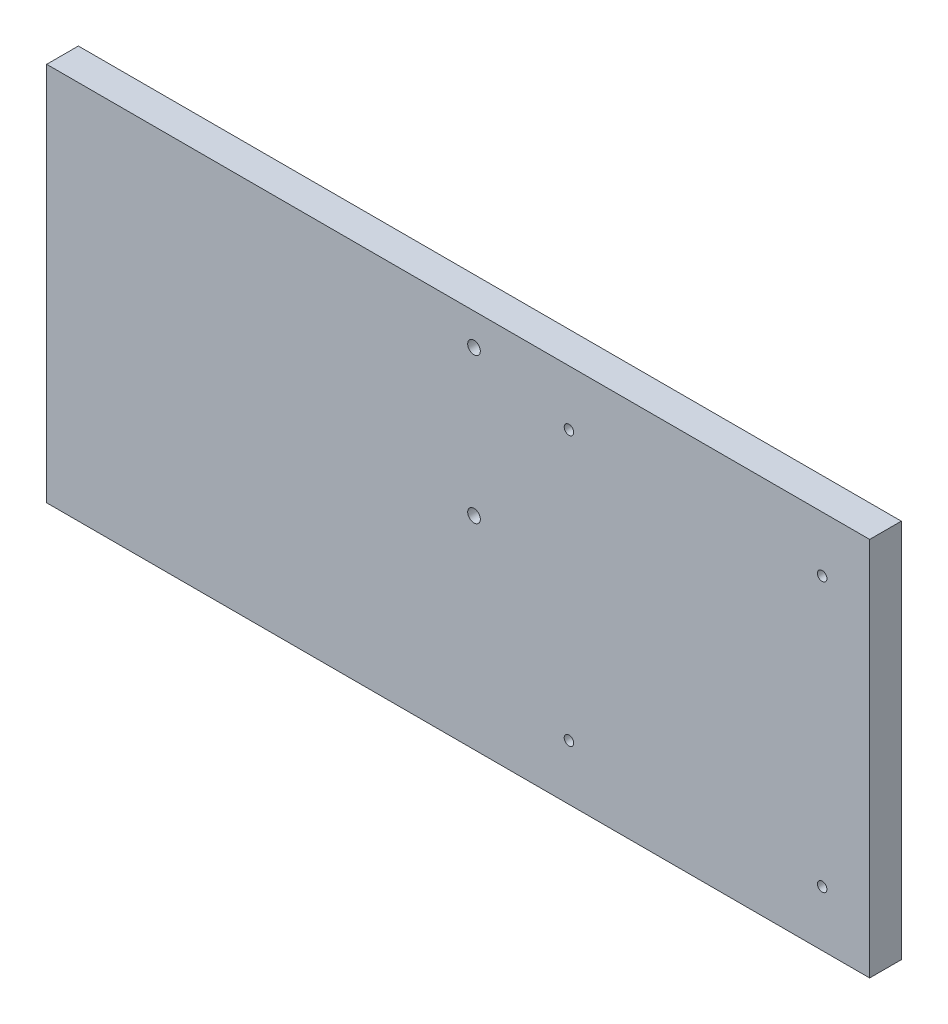
ISO-10303-21;
HEADER;
FILE_DESCRIPTION(('STEP AP214'),'2;1');
FILE_NAME('part.step','',(''),(''),'','','');
FILE_SCHEMA(('AUTOMOTIVE_DESIGN { 1 0 10303 214 1 1 1 1 }'));
ENDSEC;
DATA;
#1=APPLICATION_CONTEXT('core data for automotive mechanical design processes');
#2=APPLICATION_PROTOCOL_DEFINITION('international standard','automotive_design',2000,#1);
#3=PRODUCT_CONTEXT('',#1,'mechanical');
#4=PRODUCT('Part','Part','',(#3));
#5=PRODUCT_RELATED_PRODUCT_CATEGORY('part','',(#4));
#6=PRODUCT_DEFINITION_FORMATION('','',#4);
#7=PRODUCT_DEFINITION_CONTEXT('part definition',#1,'design');
#8=PRODUCT_DEFINITION('design','',#6,#7);
#9=PRODUCT_DEFINITION_SHAPE('','',#8);
#10=(LENGTH_UNIT() NAMED_UNIT(*) SI_UNIT(.MILLI.,.METRE.));
#11=(NAMED_UNIT(*) PLANE_ANGLE_UNIT() SI_UNIT($,.RADIAN.));
#12=(NAMED_UNIT(*) SI_UNIT($,.STERADIAN.) SOLID_ANGLE_UNIT());
#13=UNCERTAINTY_MEASURE_WITH_UNIT(LENGTH_MEASURE(1.E-05),#10,'distance_accuracy_value','');
#14=(GEOMETRIC_REPRESENTATION_CONTEXT(3) GLOBAL_UNCERTAINTY_ASSIGNED_CONTEXT((#13)) GLOBAL_UNIT_ASSIGNED_CONTEXT((#10,
#11,#12)) REPRESENTATION_CONTEXT('',''));
#15=CARTESIAN_POINT('',(0.,0.,0.));
#16=DIRECTION('',(0.,0.,1.));
#17=DIRECTION('',(1.,0.,0.));
#18=AXIS2_PLACEMENT_3D('',#15,#16,#17);
#19=CARTESIAN_POINT('',(130.,0.,10.));
#20=DIRECTION('',(1.,0.,0.));
#21=DIRECTION('',(0.,1.,0.));
#22=AXIS2_PLACEMENT_3D('',#19,#20,#21);
#23=PLANE('',#22);
#24=DIRECTION('',(0.,-1.,0.));
#25=VECTOR('',#24,1.);
#26=CARTESIAN_POINT('',(130.,0.,0.));
#27=LINE('',#26,#25);
#28=CARTESIAN_POINT('',(130.,60.,0.));
#29=VERTEX_POINT('',#28);
#30=CARTESIAN_POINT('',(130.,-60.,0.));
#31=VERTEX_POINT('',#30);
#32=EDGE_CURVE('E124',#29,#31,#27,.T.);
#33=ORIENTED_EDGE('',*,*,#32,.F.);
#34=DIRECTION('',(0.,0.,-1.));
#35=VECTOR('',#34,1.);
#36=CARTESIAN_POINT('',(130.,60.,10.));
#37=LINE('',#36,#35);
#38=CARTESIAN_POINT('',(130.,60.,10.));
#39=VERTEX_POINT('',#38);
#40=EDGE_CURVE('E11',#39,#29,#37,.T.);
#41=ORIENTED_EDGE('',*,*,#40,.F.);
#42=DIRECTION('',(0.,-1.,0.));
#43=VECTOR('',#42,1.);
#44=CARTESIAN_POINT('',(130.,0.,10.));
#45=LINE('',#44,#43);
#46=CARTESIAN_POINT('',(130.,-60.,10.));
#47=VERTEX_POINT('',#46);
#48=EDGE_CURVE('E99',#39,#47,#45,.T.);
#49=ORIENTED_EDGE('',*,*,#48,.T.);
#50=DIRECTION('',(0.,0.,-1.));
#51=VECTOR('',#50,1.);
#52=CARTESIAN_POINT('',(130.,-60.,10.));
#53=LINE('',#52,#51);
#54=EDGE_CURVE('E77',#47,#31,#53,.T.);
#55=ORIENTED_EDGE('',*,*,#54,.T.);
#56=EDGE_LOOP('',(#33,#41,#49,#55));
#57=FACE_BOUND('',#56,.T.);
#58=ADVANCED_FACE('F37',(#57),#23,.T.);
#59=CARTESIAN_POINT('',(0.,60.,10.));
#60=DIRECTION('',(0.,1.,0.));
#61=DIRECTION('',(-1.,0.,0.));
#62=AXIS2_PLACEMENT_3D('',#59,#60,#61);
#63=PLANE('',#62);
#64=DIRECTION('',(1.,0.,0.));
#65=VECTOR('',#64,1.);
#66=CARTESIAN_POINT('',(0.,60.,0.));
#67=LINE('',#66,#65);
#68=CARTESIAN_POINT('',(-130.,60.,0.));
#69=VERTEX_POINT('',#68);
#70=EDGE_CURVE('E89',#69,#29,#67,.T.);
#71=ORIENTED_EDGE('',*,*,#70,.F.);
#72=DIRECTION('',(0.,0.,-1.));
#73=VECTOR('',#72,1.);
#74=CARTESIAN_POINT('',(-130.,60.,10.));
#75=LINE('',#74,#73);
#76=CARTESIAN_POINT('',(-130.,60.,10.));
#77=VERTEX_POINT('',#76);
#78=EDGE_CURVE('E46',#77,#69,#75,.T.);
#79=ORIENTED_EDGE('',*,*,#78,.F.);
#80=DIRECTION('',(1.,0.,0.));
#81=VECTOR('',#80,1.);
#82=CARTESIAN_POINT('',(0.,60.,10.));
#83=LINE('',#82,#81);
#84=EDGE_CURVE('E87',#77,#39,#83,.T.);
#85=ORIENTED_EDGE('',*,*,#84,.T.);
#86=ORIENTED_EDGE('',*,*,#40,.T.);
#87=EDGE_LOOP('',(#71,#79,#85,#86));
#88=FACE_BOUND('',#87,.T.);
#89=ADVANCED_FACE('F85',(#88),#63,.T.);
#90=CARTESIAN_POINT('',(-130.,0.,10.));
#91=DIRECTION('',(1.,0.,0.));
#92=DIRECTION('',(0.,1.,0.));
#93=AXIS2_PLACEMENT_3D('',#90,#91,#92);
#94=PLANE('',#93);
#95=DIRECTION('',(0.,-1.,0.));
#96=VECTOR('',#95,1.);
#97=CARTESIAN_POINT('',(-130.,0.,0.));
#98=LINE('',#97,#96);
#99=CARTESIAN_POINT('',(-130.,-60.,0.));
#100=VERTEX_POINT('',#99);
#101=EDGE_CURVE('E127',#69,#100,#98,.T.);
#102=ORIENTED_EDGE('',*,*,#101,.T.);
#103=DIRECTION('',(0.,0.,-1.));
#104=VECTOR('',#103,1.);
#105=CARTESIAN_POINT('',(-130.,-60.,10.));
#106=LINE('',#105,#104);
#107=CARTESIAN_POINT('',(-130.,-60.,10.));
#108=VERTEX_POINT('',#107);
#109=EDGE_CURVE('E92',#108,#100,#106,.T.);
#110=ORIENTED_EDGE('',*,*,#109,.F.);
#111=DIRECTION('',(0.,-1.,0.));
#112=VECTOR('',#111,1.);
#113=CARTESIAN_POINT('',(-130.,0.,10.));
#114=LINE('',#113,#112);
#115=EDGE_CURVE('E94',#77,#108,#114,.T.);
#116=ORIENTED_EDGE('',*,*,#115,.F.);
#117=ORIENTED_EDGE('',*,*,#78,.T.);
#118=EDGE_LOOP('',(#102,#110,#116,#117));
#119=FACE_BOUND('',#118,.T.);
#120=ADVANCED_FACE('F95',(#119),#94,.F.);
#121=CARTESIAN_POINT('',(0.,-60.,10.));
#122=DIRECTION('',(0.,1.,0.));
#123=DIRECTION('',(-1.,0.,0.));
#124=AXIS2_PLACEMENT_3D('',#121,#122,#123);
#125=PLANE('',#124);
#126=DIRECTION('',(1.,0.,0.));
#127=VECTOR('',#126,1.);
#128=CARTESIAN_POINT('',(0.,-60.,0.));
#129=LINE('',#128,#127);
#130=EDGE_CURVE('E70',#100,#31,#129,.T.);
#131=ORIENTED_EDGE('',*,*,#130,.T.);
#132=ORIENTED_EDGE('',*,*,#54,.F.);
#133=DIRECTION('',(1.,0.,0.));
#134=VECTOR('',#133,1.);
#135=CARTESIAN_POINT('',(0.,-60.,10.));
#136=LINE('',#135,#134);
#137=EDGE_CURVE('E54',#108,#47,#136,.T.);
#138=ORIENTED_EDGE('',*,*,#137,.F.);
#139=ORIENTED_EDGE('',*,*,#109,.T.);
#140=EDGE_LOOP('',(#131,#132,#138,#139));
#141=FACE_BOUND('',#140,.T.);
#142=ADVANCED_FACE('F136',(#141),#125,.F.);
#143=CARTESIAN_POINT('',(115.,42.5,10.));
#144=DIRECTION('',(0.,0.,-1.));
#145=DIRECTION('',(-1.,0.,0.));
#146=AXIS2_PLACEMENT_3D('',#143,#144,#145);
#147=CYLINDRICAL_SURFACE('',#146,1.5);
#148=CARTESIAN_POINT('',(115.,42.5,10.));
#149=DIRECTION('',(0.,0.,1.));
#150=DIRECTION('',(1.,0.,0.));
#151=AXIS2_PLACEMENT_3D('',#148,#149,#150);
#152=CIRCLE('',#151,1.5);
#153=CARTESIAN_POINT('',(116.5,42.5,10.));
#154=VERTEX_POINT('',#153);
#155=EDGE_CURVE('E101',#154,#154,#152,.T.);
#156=ORIENTED_EDGE('',*,*,#155,.T.);
#157=EDGE_LOOP('',(#156));
#158=FACE_BOUND('',#157,.T.);
#159=CARTESIAN_POINT('',(115.,42.5,0.));
#160=DIRECTION('',(0.,0.,1.));
#161=DIRECTION('',(1.,0.,0.));
#162=AXIS2_PLACEMENT_3D('',#159,#160,#161);
#163=CIRCLE('',#162,1.5);
#164=CARTESIAN_POINT('',(116.5,42.5,0.));
#165=VERTEX_POINT('',#164);
#166=EDGE_CURVE('E121',#165,#165,#163,.T.);
#167=ORIENTED_EDGE('',*,*,#166,.F.);
#168=EDGE_LOOP('',(#167));
#169=FACE_BOUND('',#168,.T.);
#170=ADVANCED_FACE('F147',(#158,#169),#147,.F.);
#171=CARTESIAN_POINT('',(115.,-42.5,10.));
#172=DIRECTION('',(0.,0.,-1.));
#173=DIRECTION('',(-1.,0.,0.));
#174=AXIS2_PLACEMENT_3D('',#171,#172,#173);
#175=CYLINDRICAL_SURFACE('',#174,1.5);
#176=CARTESIAN_POINT('',(115.,-42.5,10.));
#177=DIRECTION('',(0.,0.,1.));
#178=DIRECTION('',(1.,0.,0.));
#179=AXIS2_PLACEMENT_3D('',#176,#177,#178);
#180=CIRCLE('',#179,1.5);
#181=CARTESIAN_POINT('',(116.5,-42.5,10.));
#182=VERTEX_POINT('',#181);
#183=EDGE_CURVE('E279',#182,#182,#180,.F.);
#184=ORIENTED_EDGE('',*,*,#183,.F.);
#185=EDGE_LOOP('',(#184));
#186=FACE_BOUND('',#185,.T.);
#187=CARTESIAN_POINT('',(115.,-42.5,0.));
#188=DIRECTION('',(0.,0.,1.));
#189=DIRECTION('',(1.,0.,0.));
#190=AXIS2_PLACEMENT_3D('',#187,#188,#189);
#191=CIRCLE('',#190,1.5);
#192=CARTESIAN_POINT('',(116.5,-42.5,0.));
#193=VERTEX_POINT('',#192);
#194=EDGE_CURVE('E118',#193,#193,#191,.F.);
#195=ORIENTED_EDGE('',*,*,#194,.T.);
#196=EDGE_LOOP('',(#195));
#197=FACE_BOUND('',#196,.T.);
#198=ADVANCED_FACE('F150',(#186,#197),#175,.F.);
#199=CARTESIAN_POINT('',(35.,42.4999999999994,10.));
#200=DIRECTION('',(0.,0.,-1.));
#201=DIRECTION('',(-1.,0.,0.));
#202=AXIS2_PLACEMENT_3D('',#199,#200,#201);
#203=CYLINDRICAL_SURFACE('',#202,1.5);
#204=CARTESIAN_POINT('',(35.,42.4999999999994,10.));
#205=DIRECTION('',(0.,0.,1.));
#206=DIRECTION('',(1.,0.,0.));
#207=AXIS2_PLACEMENT_3D('',#204,#205,#206);
#208=CIRCLE('',#207,1.5);
#209=CARTESIAN_POINT('',(36.5,42.4999999999994,10.));
#210=VERTEX_POINT('',#209);
#211=EDGE_CURVE('E275',#210,#210,#208,.T.);
#212=ORIENTED_EDGE('',*,*,#211,.T.);
#213=EDGE_LOOP('',(#212));
#214=FACE_BOUND('',#213,.T.);
#215=CARTESIAN_POINT('',(35.,42.4999999999994,0.));
#216=DIRECTION('',(0.,0.,1.));
#217=DIRECTION('',(1.,0.,0.));
#218=AXIS2_PLACEMENT_3D('',#215,#216,#217);
#219=CIRCLE('',#218,1.5);
#220=CARTESIAN_POINT('',(36.5,42.4999999999994,0.));
#221=VERTEX_POINT('',#220);
#222=EDGE_CURVE('E115',#221,#221,#219,.T.);
#223=ORIENTED_EDGE('',*,*,#222,.F.);
#224=EDGE_LOOP('',(#223));
#225=FACE_BOUND('',#224,.T.);
#226=ADVANCED_FACE('F154',(#214,#225),#203,.F.);
#227=CARTESIAN_POINT('',(4.99999999999998,50.,10.));
#228=DIRECTION('',(0.,0.,-1.));
#229=DIRECTION('',(-1.,0.,0.));
#230=AXIS2_PLACEMENT_3D('',#227,#228,#229);
#231=CYLINDRICAL_SURFACE('',#230,2.);
#232=CARTESIAN_POINT('',(4.99999999999998,50.,10.));
#233=DIRECTION('',(0.,0.,1.));
#234=DIRECTION('',(1.,0.,0.));
#235=AXIS2_PLACEMENT_3D('',#232,#233,#234);
#236=CIRCLE('',#235,2.);
#237=CARTESIAN_POINT('',(6.99999999999998,50.,10.));
#238=VERTEX_POINT('',#237);
#239=EDGE_CURVE('E169',#238,#238,#236,.T.);
#240=ORIENTED_EDGE('',*,*,#239,.T.);
#241=EDGE_LOOP('',(#240));
#242=FACE_BOUND('',#241,.T.);
#243=CARTESIAN_POINT('',(4.99999999999998,50.,0.));
#244=DIRECTION('',(0.,0.,1.));
#245=DIRECTION('',(1.,0.,0.));
#246=AXIS2_PLACEMENT_3D('',#243,#244,#245);
#247=CIRCLE('',#246,2.);
#248=CARTESIAN_POINT('',(6.99999999999998,50.,0.));
#249=VERTEX_POINT('',#248);
#250=EDGE_CURVE('E112',#249,#249,#247,.T.);
#251=ORIENTED_EDGE('',*,*,#250,.F.);
#252=EDGE_LOOP('',(#251));
#253=FACE_BOUND('',#252,.T.);
#254=ADVANCED_FACE('F157',(#242,#253),#231,.F.);
#255=CARTESIAN_POINT('',(4.99999999999998,3.99999999999997,10.));
#256=DIRECTION('',(0.,0.,-1.));
#257=DIRECTION('',(-1.,0.,0.));
#258=AXIS2_PLACEMENT_3D('',#255,#256,#257);
#259=CYLINDRICAL_SURFACE('',#258,2.);
#260=CARTESIAN_POINT('',(4.99999999999998,3.99999999999997,10.));
#261=DIRECTION('',(0.,0.,1.));
#262=DIRECTION('',(1.,0.,0.));
#263=AXIS2_PLACEMENT_3D('',#260,#261,#262);
#264=CIRCLE('',#263,2.);
#265=CARTESIAN_POINT('',(6.99999999999999,3.99999999999997,10.));
#266=VERTEX_POINT('',#265);
#267=EDGE_CURVE('E133',#266,#266,#264,.T.);
#268=ORIENTED_EDGE('',*,*,#267,.T.);
#269=EDGE_LOOP('',(#268));
#270=FACE_BOUND('',#269,.T.);
#271=CARTESIAN_POINT('',(4.99999999999998,3.99999999999997,0.));
#272=DIRECTION('',(0.,0.,1.));
#273=DIRECTION('',(1.,0.,0.));
#274=AXIS2_PLACEMENT_3D('',#271,#272,#273);
#275=CIRCLE('',#274,2.);
#276=CARTESIAN_POINT('',(6.99999999999999,3.99999999999997,0.));
#277=VERTEX_POINT('',#276);
#278=EDGE_CURVE('E109',#277,#277,#275,.T.);
#279=ORIENTED_EDGE('',*,*,#278,.F.);
#280=EDGE_LOOP('',(#279));
#281=FACE_BOUND('',#280,.T.);
#282=ADVANCED_FACE('F39',(#270,#281),#259,.F.);
#283=CARTESIAN_POINT('',(35.,-42.5000000000006,10.));
#284=DIRECTION('',(0.,0.,-1.));
#285=DIRECTION('',(-1.,0.,0.));
#286=AXIS2_PLACEMENT_3D('',#283,#284,#285);
#287=CYLINDRICAL_SURFACE('',#286,1.5);
#288=CARTESIAN_POINT('',(35.,-42.5000000000006,10.));
#289=DIRECTION('',(0.,0.,1.));
#290=DIRECTION('',(1.,0.,0.));
#291=AXIS2_PLACEMENT_3D('',#288,#289,#290);
#292=CIRCLE('',#291,1.5);
#293=CARTESIAN_POINT('',(36.5,-42.5000000000006,10.));
#294=VERTEX_POINT('',#293);
#295=EDGE_CURVE('E106',#294,#294,#292,.F.);
#296=ORIENTED_EDGE('',*,*,#295,.F.);
#297=EDGE_LOOP('',(#296));
#298=FACE_BOUND('',#297,.T.);
#299=CARTESIAN_POINT('',(35.,-42.5000000000006,0.));
#300=DIRECTION('',(0.,0.,1.));
#301=DIRECTION('',(1.,0.,0.));
#302=AXIS2_PLACEMENT_3D('',#299,#300,#301);
#303=CIRCLE('',#302,1.5);
#304=CARTESIAN_POINT('',(36.5,-42.5000000000006,0.));
#305=VERTEX_POINT('',#304);
#306=EDGE_CURVE('E130',#305,#305,#303,.F.);
#307=ORIENTED_EDGE('',*,*,#306,.T.);
#308=EDGE_LOOP('',(#307));
#309=FACE_BOUND('',#308,.T.);
#310=ADVANCED_FACE('F164',(#298,#309),#287,.F.);
#311=CARTESIAN_POINT('',(0.,0.,10.));
#312=DIRECTION('',(0.,0.,1.));
#313=DIRECTION('',(1.,0.,0.));
#314=AXIS2_PLACEMENT_3D('',#311,#312,#313);
#315=PLANE('',#314);
#316=ORIENTED_EDGE('',*,*,#267,.F.);
#317=EDGE_LOOP('',(#316));
#318=FACE_BOUND('',#317,.T.);
#319=ORIENTED_EDGE('',*,*,#239,.F.);
#320=EDGE_LOOP('',(#319));
#321=FACE_BOUND('',#320,.T.);
#322=ORIENTED_EDGE('',*,*,#211,.F.);
#323=EDGE_LOOP('',(#322));
#324=FACE_BOUND('',#323,.T.);
#325=ORIENTED_EDGE('',*,*,#183,.T.);
#326=EDGE_LOOP('',(#325));
#327=FACE_BOUND('',#326,.T.);
#328=ORIENTED_EDGE('',*,*,#155,.F.);
#329=EDGE_LOOP('',(#328));
#330=FACE_BOUND('',#329,.T.);
#331=ORIENTED_EDGE('',*,*,#48,.F.);
#332=ORIENTED_EDGE('',*,*,#84,.F.);
#333=ORIENTED_EDGE('',*,*,#115,.T.);
#334=ORIENTED_EDGE('',*,*,#137,.T.);
#335=EDGE_LOOP('',(#331,#332,#333,#334));
#336=FACE_BOUND('',#335,.T.);
#337=ORIENTED_EDGE('',*,*,#295,.T.);
#338=EDGE_LOOP('',(#337));
#339=FACE_BOUND('',#338,.T.);
#340=ADVANCED_FACE('F97',(#318,#321,#324,#327,#330,#336,#339),#315,.T.);
#341=CARTESIAN_POINT('',(0.,0.,0.));
#342=DIRECTION('',(0.,0.,1.));
#343=DIRECTION('',(1.,0.,0.));
#344=AXIS2_PLACEMENT_3D('',#341,#342,#343);
#345=PLANE('',#344);
#346=ORIENTED_EDGE('',*,*,#278,.T.);
#347=EDGE_LOOP('',(#346));
#348=FACE_BOUND('',#347,.T.);
#349=ORIENTED_EDGE('',*,*,#250,.T.);
#350=EDGE_LOOP('',(#349));
#351=FACE_BOUND('',#350,.T.);
#352=ORIENTED_EDGE('',*,*,#222,.T.);
#353=EDGE_LOOP('',(#352));
#354=FACE_BOUND('',#353,.T.);
#355=ORIENTED_EDGE('',*,*,#194,.F.);
#356=EDGE_LOOP('',(#355));
#357=FACE_BOUND('',#356,.T.);
#358=ORIENTED_EDGE('',*,*,#166,.T.);
#359=EDGE_LOOP('',(#358));
#360=FACE_BOUND('',#359,.T.);
#361=ORIENTED_EDGE('',*,*,#32,.T.);
#362=ORIENTED_EDGE('',*,*,#130,.F.);
#363=ORIENTED_EDGE('',*,*,#101,.F.);
#364=ORIENTED_EDGE('',*,*,#70,.T.);
#365=EDGE_LOOP('',(#361,#362,#363,#364));
#366=FACE_BOUND('',#365,.T.);
#367=ORIENTED_EDGE('',*,*,#306,.F.);
#368=EDGE_LOOP('',(#367));
#369=FACE_BOUND('',#368,.T.);
#370=ADVANCED_FACE('F137',(#348,#351,#354,#357,#360,#366,#369),#345,.F.);
#371=CLOSED_SHELL('',(#58,#89,#120,#142,#170,#198,#226,#254,#282,#310,#340,#370));
#372=MANIFOLD_SOLID_BREP('B2',#371);
#373=ADVANCED_BREP_SHAPE_REPRESENTATION('',(#18,#372),#14);
#374=SHAPE_DEFINITION_REPRESENTATION(#9,#373);
ENDSEC;
END-ISO-10303-21;
